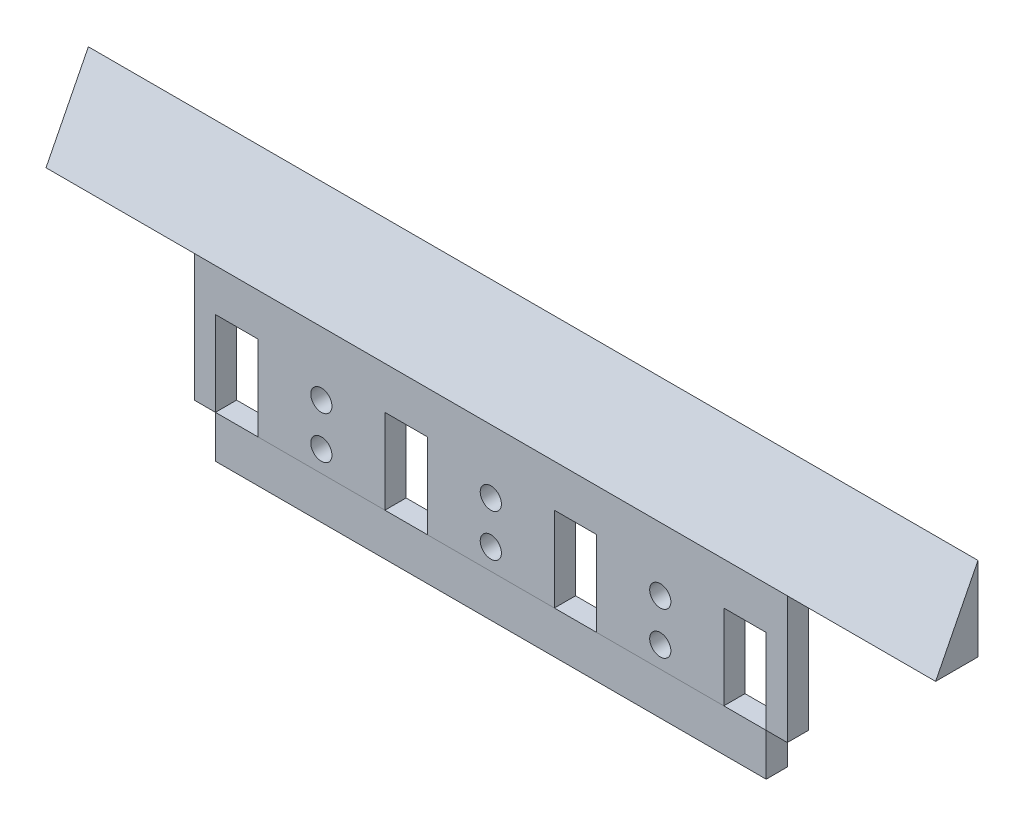
ISO-10303-21;
HEADER;
FILE_DESCRIPTION(('STEP AP214'),'2;1');
FILE_NAME('part.step','',(''),(''),'','','');
FILE_SCHEMA(('AUTOMOTIVE_DESIGN { 1 0 10303 214 1 1 1 1 }'));
ENDSEC;
DATA;
#1=APPLICATION_CONTEXT('core data for automotive mechanical design processes');
#2=APPLICATION_PROTOCOL_DEFINITION('international standard','automotive_design',2000,#1);
#3=PRODUCT_CONTEXT('',#1,'mechanical');
#4=PRODUCT('Part','Part','',(#3));
#5=PRODUCT_RELATED_PRODUCT_CATEGORY('part','',(#4));
#6=PRODUCT_DEFINITION_FORMATION('','',#4);
#7=PRODUCT_DEFINITION_CONTEXT('part definition',#1,'design');
#8=PRODUCT_DEFINITION('design','',#6,#7);
#9=PRODUCT_DEFINITION_SHAPE('','',#8);
#10=(LENGTH_UNIT() NAMED_UNIT(*) SI_UNIT(.MILLI.,.METRE.));
#11=(NAMED_UNIT(*) PLANE_ANGLE_UNIT() SI_UNIT($,.RADIAN.));
#12=(NAMED_UNIT(*) SI_UNIT($,.STERADIAN.) SOLID_ANGLE_UNIT());
#13=UNCERTAINTY_MEASURE_WITH_UNIT(LENGTH_MEASURE(1.E-05),#10,'distance_accuracy_value','');
#14=(GEOMETRIC_REPRESENTATION_CONTEXT(3) GLOBAL_UNCERTAINTY_ASSIGNED_CONTEXT((#13)) GLOBAL_UNIT_ASSIGNED_CONTEXT((#10,
#11,#12)) REPRESENTATION_CONTEXT('',''));
#15=CARTESIAN_POINT('',(0.,0.,0.));
#16=DIRECTION('',(0.,0.,1.));
#17=DIRECTION('',(1.,0.,0.));
#18=AXIS2_PLACEMENT_3D('',#15,#16,#17);
#19=CARTESIAN_POINT('',(7868.76400398858,2295.87786259542,0.));
#20=DIRECTION('',(1.,0.,0.));
#21=DIRECTION('',(0.,0.,-1.));
#22=AXIS2_PLACEMENT_3D('',#19,#20,#21);
#23=PLANE('',#22);
#24=DIRECTION('',(0.,0.,-1.));
#25=VECTOR('',#24,1.);
#26=CARTESIAN_POINT('',(7868.76400398858,2305.87786259542,0.));
#27=LINE('',#26,#25);
#28=CARTESIAN_POINT('',(7868.76400398858,2305.87786259542,5.));
#29=VERTEX_POINT('',#28);
#30=CARTESIAN_POINT('',(7868.76400398858,2305.87786259542,0.));
#31=VERTEX_POINT('',#30);
#32=EDGE_CURVE('E108',#29,#31,#27,.T.);
#33=ORIENTED_EDGE('',*,*,#32,.T.);
#34=DIRECTION('',(0.,1.,0.));
#35=VECTOR('',#34,1.);
#36=CARTESIAN_POINT('',(7868.76400398858,2295.87786259542,0.));
#37=LINE('',#36,#35);
#38=CARTESIAN_POINT('',(7868.76400398858,2295.87786259542,0.));
#39=VERTEX_POINT('',#38);
#40=EDGE_CURVE('E12',#39,#31,#37,.T.);
#41=ORIENTED_EDGE('',*,*,#40,.F.);
#42=DIRECTION('',(0.,0.,-1.));
#43=VECTOR('',#42,1.);
#44=CARTESIAN_POINT('',(7868.76400398858,2295.87786259542,0.));
#45=LINE('',#44,#43);
#46=CARTESIAN_POINT('',(7868.76400398858,2295.87786259542,5.));
#47=VERTEX_POINT('',#46);
#48=EDGE_CURVE('E96',#47,#39,#45,.T.);
#49=ORIENTED_EDGE('',*,*,#48,.F.);
#50=DIRECTION('',(0.,1.,0.));
#51=VECTOR('',#50,1.);
#52=CARTESIAN_POINT('',(7868.76400398858,2295.87786259542,5.));
#53=LINE('',#52,#51);
#54=EDGE_CURVE('E104',#47,#29,#53,.T.);
#55=ORIENTED_EDGE('',*,*,#54,.T.);
#56=EDGE_LOOP('',(#33,#41,#49,#55));
#57=FACE_BOUND('',#56,.T.);
#58=ADVANCED_FACE('F45',(#57),#23,.F.);
#59=CARTESIAN_POINT('',(7868.76400398858,2295.87786259542,0.));
#60=DIRECTION('',(0.,0.,1.));
#61=DIRECTION('',(1.,0.,0.));
#62=AXIS2_PLACEMENT_3D('',#59,#60,#61);
#63=PLANE('',#62);
#64=DIRECTION('',(1.,0.,0.));
#65=VECTOR('',#64,1.);
#66=CARTESIAN_POINT('',(7868.76400398858,2305.87786259542,0.));
#67=LINE('',#66,#65);
#68=CARTESIAN_POINT('',(7998.76400398858,2305.87786259542,0.));
#69=VERTEX_POINT('',#68);
#70=EDGE_CURVE('E100',#31,#69,#67,.T.);
#71=ORIENTED_EDGE('',*,*,#70,.T.);
#72=DIRECTION('',(0.,1.,0.));
#73=VECTOR('',#72,1.);
#74=CARTESIAN_POINT('',(7998.76400398858,2295.87786259542,0.));
#75=LINE('',#74,#73);
#76=CARTESIAN_POINT('',(7998.76400398858,2295.87786259542,0.));
#77=VERTEX_POINT('',#76);
#78=EDGE_CURVE('E53',#77,#69,#75,.T.);
#79=ORIENTED_EDGE('',*,*,#78,.F.);
#80=DIRECTION('',(1.,0.,0.));
#81=VECTOR('',#80,1.);
#82=CARTESIAN_POINT('',(7868.76400398858,2295.87786259542,0.));
#83=LINE('',#82,#81);
#84=EDGE_CURVE('E91',#39,#77,#83,.T.);
#85=ORIENTED_EDGE('',*,*,#84,.F.);
#86=ORIENTED_EDGE('',*,*,#40,.T.);
#87=EDGE_LOOP('',(#71,#79,#85,#86));
#88=FACE_BOUND('',#87,.T.);
#89=ADVANCED_FACE('F99',(#88),#63,.F.);
#90=CARTESIAN_POINT('',(7998.76400398858,2295.87786259542,0.));
#91=DIRECTION('',(-1.,0.,0.));
#92=DIRECTION('',(0.,0.,1.));
#93=AXIS2_PLACEMENT_3D('',#90,#91,#92);
#94=PLANE('',#93);
#95=DIRECTION('',(0.,0.,1.));
#96=VECTOR('',#95,1.);
#97=CARTESIAN_POINT('',(7998.76400398858,2305.87786259542,0.));
#98=LINE('',#97,#96);
#99=CARTESIAN_POINT('',(7998.76400398858,2305.87786259542,5.));
#100=VERTEX_POINT('',#99);
#101=EDGE_CURVE('E78',#69,#100,#98,.T.);
#102=ORIENTED_EDGE('',*,*,#101,.T.);
#103=DIRECTION('',(0.,1.,0.));
#104=VECTOR('',#103,1.);
#105=CARTESIAN_POINT('',(7998.76400398858,2295.87786259542,5.));
#106=LINE('',#105,#104);
#107=CARTESIAN_POINT('',(7998.76400398858,2295.87786259542,5.));
#108=VERTEX_POINT('',#107);
#109=EDGE_CURVE('E101',#108,#100,#106,.T.);
#110=ORIENTED_EDGE('',*,*,#109,.F.);
#111=DIRECTION('',(0.,0.,1.));
#112=VECTOR('',#111,1.);
#113=CARTESIAN_POINT('',(7998.76400398858,2295.87786259542,0.));
#114=LINE('',#113,#112);
#115=EDGE_CURVE('E94',#77,#108,#114,.T.);
#116=ORIENTED_EDGE('',*,*,#115,.F.);
#117=ORIENTED_EDGE('',*,*,#78,.T.);
#118=EDGE_LOOP('',(#102,#110,#116,#117));
#119=FACE_BOUND('',#118,.T.);
#120=ADVANCED_FACE('F102',(#119),#94,.F.);
#121=CARTESIAN_POINT('',(7868.76400398858,2295.87786259542,5.));
#122=DIRECTION('',(0.,0.,-1.));
#123=DIRECTION('',(-1.,0.,0.));
#124=AXIS2_PLACEMENT_3D('',#121,#122,#123);
#125=PLANE('',#124);
#126=DIRECTION('',(-1.,0.,0.));
#127=VECTOR('',#126,1.);
#128=CARTESIAN_POINT('',(7868.76400398858,2305.87786259542,5.));
#129=LINE('',#128,#127);
#130=EDGE_CURVE('E84',#100,#29,#129,.T.);
#131=ORIENTED_EDGE('',*,*,#130,.T.);
#132=ORIENTED_EDGE('',*,*,#54,.F.);
#133=DIRECTION('',(-1.,0.,0.));
#134=VECTOR('',#133,1.);
#135=CARTESIAN_POINT('',(7868.76400398858,2295.87786259542,5.));
#136=LINE('',#135,#134);
#137=EDGE_CURVE('E61',#108,#47,#136,.T.);
#138=ORIENTED_EDGE('',*,*,#137,.F.);
#139=ORIENTED_EDGE('',*,*,#109,.T.);
#140=EDGE_LOOP('',(#131,#132,#138,#139));
#141=FACE_BOUND('',#140,.T.);
#142=ADVANCED_FACE('F115',(#141),#125,.F.);
#143=CARTESIAN_POINT('',(0.,2295.87786259542,0.));
#144=DIRECTION('',(0.,1.,0.));
#145=DIRECTION('',(0.,0.,1.));
#146=AXIS2_PLACEMENT_3D('',#143,#144,#145);
#147=PLANE('',#146);
#148=ORIENTED_EDGE('',*,*,#48,.T.);
#149=ORIENTED_EDGE('',*,*,#84,.T.);
#150=ORIENTED_EDGE('',*,*,#115,.T.);
#151=ORIENTED_EDGE('',*,*,#137,.T.);
#152=EDGE_LOOP('',(#148,#149,#150,#151));
#153=FACE_BOUND('',#152,.T.);
#154=ADVANCED_FACE('F92',(#153),#147,.F.);
#155=CARTESIAN_POINT('',(0.,2305.87786259542,0.));
#156=DIRECTION('',(0.,1.,0.));
#157=DIRECTION('',(0.,0.,1.));
#158=AXIS2_PLACEMENT_3D('',#155,#156,#157);
#159=PLANE('',#158);
#160=ORIENTED_EDGE('',*,*,#32,.F.);
#161=ORIENTED_EDGE('',*,*,#130,.F.);
#162=ORIENTED_EDGE('',*,*,#101,.F.);
#163=ORIENTED_EDGE('',*,*,#70,.F.);
#164=EDGE_LOOP('',(#160,#161,#162,#163));
#165=FACE_BOUND('',#164,.T.);
#166=ADVANCED_FACE('F118',(#165),#159,.T.);
#167=CLOSED_SHELL('',(#58,#89,#120,#142,#154,#166));
#168=MANIFOLD_SOLID_BREP('B2',#167);
#169=CARTESIAN_POINT('',(7863.76400398858,2335.87786259542,5.));
#170=DIRECTION('',(1.,0.,0.));
#171=DIRECTION('',(0.,1.,0.));
#172=AXIS2_PLACEMENT_3D('',#169,#170,#171);
#173=PLANE('',#172);
#174=DIRECTION('',(0.,-4.88498130835069E-13,1.));
#175=VECTOR('',#174,1.);
#176=CARTESIAN_POINT('',(7863.76400398858,2335.87786259542,5.));
#177=LINE('',#176,#175);
#178=CARTESIAN_POINT('',(7863.76400398858,2335.87786259542,0.));
#179=VERTEX_POINT('',#178);
#180=CARTESIAN_POINT('',(7863.76400398858,2335.87786259542,5.));
#181=VERTEX_POINT('',#180);
#182=EDGE_CURVE('E43',#179,#181,#177,.T.);
#183=ORIENTED_EDGE('',*,*,#182,.F.);
#184=DIRECTION('',(0.,-1.,0.));
#185=VECTOR('',#184,1.);
#186=CARTESIAN_POINT('',(7863.76400398858,2335.87786259542,0.));
#187=LINE('',#186,#185);
#188=CARTESIAN_POINT('',(7863.76400398858,2305.87786259542,0.));
#189=VERTEX_POINT('',#188);
#190=EDGE_CURVE('E472',#179,#189,#187,.T.);
#191=ORIENTED_EDGE('',*,*,#190,.T.);
#192=DIRECTION('',(0.,0.,-1.));
#193=VECTOR('',#192,1.);
#194=CARTESIAN_POINT('',(7863.76400398858,2305.87786259542,5.));
#195=LINE('',#194,#193);
#196=CARTESIAN_POINT('',(7863.76400398858,2305.87786259542,5.));
#197=VERTEX_POINT('',#196);
#198=EDGE_CURVE('E177',#197,#189,#195,.T.);
#199=ORIENTED_EDGE('',*,*,#198,.F.);
#200=DIRECTION('',(0.,-1.,0.));
#201=VECTOR('',#200,1.);
#202=CARTESIAN_POINT('',(7863.76400398858,2335.87786259542,5.));
#203=LINE('',#202,#201);
#204=EDGE_CURVE('E437',#181,#197,#203,.T.);
#205=ORIENTED_EDGE('',*,*,#204,.F.);
#206=EDGE_LOOP('',(#183,#191,#199,#205));
#207=FACE_BOUND('',#206,.T.);
#208=ADVANCED_FACE('F169',(#207),#173,.F.);
#209=CARTESIAN_POINT('',(8003.76400398858,2335.87786259542,5.));
#210=DIRECTION('',(-1.,0.,0.));
#211=DIRECTION('',(0.,0.,1.));
#212=AXIS2_PLACEMENT_3D('',#209,#210,#211);
#213=PLANE('',#212);
#214=DIRECTION('',(0.,8.88178419700126E-13,-1.));
#215=VECTOR('',#214,1.);
#216=CARTESIAN_POINT('',(8003.76400398858,2335.87786259542,5.));
#217=LINE('',#216,#215);
#218=CARTESIAN_POINT('',(8003.76400398858,2335.87786259542,5.));
#219=VERTEX_POINT('',#218);
#220=CARTESIAN_POINT('',(8003.76400398858,2335.87786259542,0.));
#221=VERTEX_POINT('',#220);
#222=EDGE_CURVE('E466',#219,#221,#217,.T.);
#223=ORIENTED_EDGE('',*,*,#222,.F.);
#224=DIRECTION('',(0.,1.,0.));
#225=VECTOR('',#224,1.);
#226=CARTESIAN_POINT('',(8003.76400398858,2335.87786259542,5.));
#227=LINE('',#226,#225);
#228=CARTESIAN_POINT('',(8003.76400398858,2305.87786259542,5.));
#229=VERTEX_POINT('',#228);
#230=EDGE_CURVE('E432',#229,#219,#227,.T.);
#231=ORIENTED_EDGE('',*,*,#230,.F.);
#232=DIRECTION('',(0.,0.,-1.));
#233=VECTOR('',#232,1.);
#234=CARTESIAN_POINT('',(8003.76400398858,2305.87786259542,5.));
#235=LINE('',#234,#233);
#236=CARTESIAN_POINT('',(8003.76400398858,2305.87786259542,0.));
#237=VERTEX_POINT('',#236);
#238=EDGE_CURVE('E444',#229,#237,#235,.T.);
#239=ORIENTED_EDGE('',*,*,#238,.T.);
#240=DIRECTION('',(0.,1.,0.));
#241=VECTOR('',#240,1.);
#242=CARTESIAN_POINT('',(8003.76400398858,2335.87786259542,0.));
#243=LINE('',#242,#241);
#244=EDGE_CURVE('E448',#237,#221,#243,.T.);
#245=ORIENTED_EDGE('',*,*,#244,.T.);
#246=EDGE_LOOP('',(#223,#231,#239,#245));
#247=FACE_BOUND('',#246,.T.);
#248=ADVANCED_FACE('F463',(#247),#213,.F.);
#249=CARTESIAN_POINT('',(7863.76400398858,2305.87786259542,5.));
#250=DIRECTION('',(0.,1.,0.));
#251=DIRECTION('',(0.,0.,1.));
#252=AXIS2_PLACEMENT_3D('',#249,#250,#251);
#253=PLANE('',#252);
#254=DIRECTION('',(1.,0.,0.));
#255=VECTOR('',#254,1.);
#256=CARTESIAN_POINT('',(7863.76400398858,2305.87786259542,5.));
#257=LINE('',#256,#255);
#258=CARTESIAN_POINT('',(7878.76400398858,2305.87786259542,5.));
#259=VERTEX_POINT('',#258);
#260=CARTESIAN_POINT('',(7908.76400398858,2305.87786259542,5.));
#261=VERTEX_POINT('',#260);
#262=EDGE_CURVE('E417',#259,#261,#257,.T.);
#263=ORIENTED_EDGE('',*,*,#262,.F.);
#264=DIRECTION('',(0.,0.,-1.));
#265=VECTOR('',#264,1.);
#266=CARTESIAN_POINT('',(7878.76400398858,2305.87786259542,50.));
#267=LINE('',#266,#265);
#268=CARTESIAN_POINT('',(7878.76400398858,2305.87786259542,0.));
#269=VERTEX_POINT('',#268);
#270=EDGE_CURVE('E426',#259,#269,#267,.T.);
#271=ORIENTED_EDGE('',*,*,#270,.T.);
#272=DIRECTION('',(1.,0.,0.));
#273=VECTOR('',#272,1.);
#274=CARTESIAN_POINT('',(7863.76400398858,2305.87786259542,0.));
#275=LINE('',#274,#273);
#276=CARTESIAN_POINT('',(7908.76400398858,2305.87786259542,0.));
#277=VERTEX_POINT('',#276);
#278=EDGE_CURVE('E193',#269,#277,#275,.T.);
#279=ORIENTED_EDGE('',*,*,#278,.T.);
#280=DIRECTION('',(0.,0.,-1.));
#281=VECTOR('',#280,1.);
#282=CARTESIAN_POINT('',(7908.76400398858,2305.87786259542,50.));
#283=LINE('',#282,#281);
#284=EDGE_CURVE('E427',#261,#277,#283,.T.);
#285=ORIENTED_EDGE('',*,*,#284,.F.);
#286=EDGE_LOOP('',(#263,#271,#279,#285));
#287=FACE_BOUND('',#286,.T.);
#288=ADVANCED_FACE('F425',(#287),#253,.F.);
#289=CARTESIAN_POINT('',(7918.76400398858,2305.87786259542,5.));
#290=VERTEX_POINT('',#289);
#291=CARTESIAN_POINT('',(7948.76400398858,2305.87786259542,5.));
#292=VERTEX_POINT('',#291);
#293=EDGE_CURVE('E429',#290,#292,#257,.T.);
#294=ORIENTED_EDGE('',*,*,#293,.F.);
#295=DIRECTION('',(0.,0.,-1.));
#296=VECTOR('',#295,1.);
#297=CARTESIAN_POINT('',(7918.76400398858,2305.87786259542,50.));
#298=LINE('',#297,#296);
#299=CARTESIAN_POINT('',(7918.76400398858,2305.87786259542,0.));
#300=VERTEX_POINT('',#299);
#301=EDGE_CURVE('E513',#290,#300,#298,.T.);
#302=ORIENTED_EDGE('',*,*,#301,.T.);
#303=CARTESIAN_POINT('',(7948.76400398858,2305.87786259542,0.));
#304=VERTEX_POINT('',#303);
#305=EDGE_CURVE('E604',#300,#304,#275,.T.);
#306=ORIENTED_EDGE('',*,*,#305,.T.);
#307=DIRECTION('',(0.,0.,-1.));
#308=VECTOR('',#307,1.);
#309=CARTESIAN_POINT('',(7948.76400398858,2305.87786259542,50.));
#310=LINE('',#309,#308);
#311=EDGE_CURVE('E541',#292,#304,#310,.T.);
#312=ORIENTED_EDGE('',*,*,#311,.F.);
#313=EDGE_LOOP('',(#294,#302,#306,#312));
#314=FACE_BOUND('',#313,.T.);
#315=ADVANCED_FACE('F609',(#314),#253,.F.);
#316=CARTESIAN_POINT('',(7958.76400398858,2305.87786259542,5.));
#317=VERTEX_POINT('',#316);
#318=CARTESIAN_POINT('',(7988.76400398858,2305.87786259542,5.));
#319=VERTEX_POINT('',#318);
#320=EDGE_CURVE('E434',#317,#319,#257,.T.);
#321=ORIENTED_EDGE('',*,*,#320,.F.);
#322=DIRECTION('',(0.,0.,-1.));
#323=VECTOR('',#322,1.);
#324=CARTESIAN_POINT('',(7958.76400398858,2305.87786259542,50.));
#325=LINE('',#324,#323);
#326=CARTESIAN_POINT('',(7958.76400398858,2305.87786259542,0.));
#327=VERTEX_POINT('',#326);
#328=EDGE_CURVE('E535',#317,#327,#325,.T.);
#329=ORIENTED_EDGE('',*,*,#328,.T.);
#330=CARTESIAN_POINT('',(7988.76400398858,2305.87786259542,0.));
#331=VERTEX_POINT('',#330);
#332=EDGE_CURVE('E580',#327,#331,#275,.T.);
#333=ORIENTED_EDGE('',*,*,#332,.T.);
#334=DIRECTION('',(0.,0.,-1.));
#335=VECTOR('',#334,1.);
#336=CARTESIAN_POINT('',(7988.76400398858,2305.87786259542,50.));
#337=LINE('',#336,#335);
#338=EDGE_CURVE('E566',#319,#331,#337,.T.);
#339=ORIENTED_EDGE('',*,*,#338,.F.);
#340=EDGE_LOOP('',(#321,#329,#333,#339));
#341=FACE_BOUND('',#340,.T.);
#342=ADVANCED_FACE('F660',(#341),#253,.F.);
#343=CARTESIAN_POINT('',(7998.76400398858,2305.87786259542,5.));
#344=VERTEX_POINT('',#343);
#345=EDGE_CURVE('E433',#344,#229,#257,.T.);
#346=ORIENTED_EDGE('',*,*,#345,.F.);
#347=DIRECTION('',(0.,0.,-1.));
#348=VECTOR('',#347,1.);
#349=CARTESIAN_POINT('',(7998.76400398858,2305.87786259542,50.));
#350=LINE('',#349,#348);
#351=CARTESIAN_POINT('',(7998.76400398858,2305.87786259542,0.));
#352=VERTEX_POINT('',#351);
#353=EDGE_CURVE('E560',#344,#352,#350,.T.);
#354=ORIENTED_EDGE('',*,*,#353,.T.);
#355=EDGE_CURVE('E449',#352,#237,#275,.T.);
#356=ORIENTED_EDGE('',*,*,#355,.T.);
#357=ORIENTED_EDGE('',*,*,#238,.F.);
#358=EDGE_LOOP('',(#346,#354,#356,#357));
#359=FACE_BOUND('',#358,.T.);
#360=ADVANCED_FACE('F588',(#359),#253,.F.);
#361=CARTESIAN_POINT('',(7868.76400398858,2305.87786259542,0.));
#362=VERTEX_POINT('',#361);
#363=EDGE_CURVE('E445',#189,#362,#275,.T.);
#364=ORIENTED_EDGE('',*,*,#363,.T.);
#365=DIRECTION('',(0.,0.,-1.));
#366=VECTOR('',#365,1.);
#367=CARTESIAN_POINT('',(7868.76400398858,2305.87786259542,50.));
#368=LINE('',#367,#366);
#369=CARTESIAN_POINT('',(7868.76400398858,2305.87786259542,5.));
#370=VERTEX_POINT('',#369);
#371=EDGE_CURVE('E185',#370,#362,#368,.T.);
#372=ORIENTED_EDGE('',*,*,#371,.F.);
#373=EDGE_CURVE('E428',#197,#370,#257,.T.);
#374=ORIENTED_EDGE('',*,*,#373,.F.);
#375=ORIENTED_EDGE('',*,*,#198,.T.);
#376=EDGE_LOOP('',(#364,#372,#374,#375));
#377=FACE_BOUND('',#376,.T.);
#378=ADVANCED_FACE('F406',(#377),#253,.F.);
#379=CARTESIAN_POINT('',(0.,0.,5.));
#380=DIRECTION('',(0.,0.,1.));
#381=DIRECTION('',(1.,0.,0.));
#382=AXIS2_PLACEMENT_3D('',#379,#380,#381);
#383=PLANE('',#382);
#384=CARTESIAN_POINT('',(7973.76400398858,2310.87786259542,5.));
#385=DIRECTION('',(0.,0.,1.));
#386=DIRECTION('',(1.,0.,0.));
#387=AXIS2_PLACEMENT_3D('',#384,#385,#386);
#388=CIRCLE('',#387,2.50000000000016);
#389=CARTESIAN_POINT('',(7976.26400398858,2310.87786259542,5.));
#390=VERTEX_POINT('',#389);
#391=EDGE_CURVE('E392',#390,#390,#388,.T.);
#392=ORIENTED_EDGE('',*,*,#391,.F.);
#393=EDGE_LOOP('',(#392));
#394=FACE_BOUND('',#393,.T.);
#395=CARTESIAN_POINT('',(7973.76400398858,2320.87786259543,5.));
#396=DIRECTION('',(0.,0.,1.));
#397=DIRECTION('',(1.,0.,0.));
#398=AXIS2_PLACEMENT_3D('',#395,#396,#397);
#399=CIRCLE('',#398,2.50000000000016);
#400=CARTESIAN_POINT('',(7976.26400398858,2320.87786259543,5.));
#401=VERTEX_POINT('',#400);
#402=EDGE_CURVE('E382',#401,#401,#399,.T.);
#403=ORIENTED_EDGE('',*,*,#402,.F.);
#404=EDGE_LOOP('',(#403));
#405=FACE_BOUND('',#404,.T.);
#406=CARTESIAN_POINT('',(7933.76400398858,2310.87786259542,5.));
#407=DIRECTION('',(0.,0.,1.));
#408=DIRECTION('',(1.,0.,0.));
#409=AXIS2_PLACEMENT_3D('',#406,#407,#408);
#410=CIRCLE('',#409,2.50000000000016);
#411=CARTESIAN_POINT('',(7936.26400398858,2310.87786259542,5.));
#412=VERTEX_POINT('',#411);
#413=EDGE_CURVE('E379',#412,#412,#410,.T.);
#414=ORIENTED_EDGE('',*,*,#413,.F.);
#415=EDGE_LOOP('',(#414));
#416=FACE_BOUND('',#415,.T.);
#417=CARTESIAN_POINT('',(7933.76400398858,2320.87786259543,5.));
#418=DIRECTION('',(0.,0.,1.));
#419=DIRECTION('',(1.,0.,0.));
#420=AXIS2_PLACEMENT_3D('',#417,#418,#419);
#421=CIRCLE('',#420,2.50000000000016);
#422=CARTESIAN_POINT('',(7936.26400398858,2320.87786259543,5.));
#423=VERTEX_POINT('',#422);
#424=EDGE_CURVE('E376',#423,#423,#421,.T.);
#425=ORIENTED_EDGE('',*,*,#424,.F.);
#426=EDGE_LOOP('',(#425));
#427=FACE_BOUND('',#426,.T.);
#428=CARTESIAN_POINT('',(7893.76400398858,2310.87786259542,5.));
#429=DIRECTION('',(0.,0.,1.));
#430=DIRECTION('',(1.,0.,0.));
#431=AXIS2_PLACEMENT_3D('',#428,#429,#430);
#432=CIRCLE('',#431,2.50000000000016);
#433=CARTESIAN_POINT('',(7896.26400398858,2310.87786259542,5.));
#434=VERTEX_POINT('',#433);
#435=EDGE_CURVE('E372',#434,#434,#432,.T.);
#436=ORIENTED_EDGE('',*,*,#435,.F.);
#437=EDGE_LOOP('',(#436));
#438=FACE_BOUND('',#437,.T.);
#439=CARTESIAN_POINT('',(7893.76400398858,2320.87786259543,5.));
#440=DIRECTION('',(0.,0.,1.));
#441=DIRECTION('',(1.,0.,0.));
#442=AXIS2_PLACEMENT_3D('',#439,#440,#441);
#443=CIRCLE('',#442,2.50000000000016);
#444=CARTESIAN_POINT('',(7896.26400398858,2320.87786259543,5.));
#445=VERTEX_POINT('',#444);
#446=EDGE_CURVE('E355',#445,#445,#443,.T.);
#447=ORIENTED_EDGE('',*,*,#446,.F.);
#448=EDGE_LOOP('',(#447));
#449=FACE_BOUND('',#448,.T.);
#450=DIRECTION('',(0.,1.,0.));
#451=VECTOR('',#450,1.);
#452=CARTESIAN_POINT('',(7878.76400398858,0.,5.));
#453=LINE('',#452,#451);
#454=CARTESIAN_POINT('',(7878.76400398858,2325.87786259543,5.));
#455=VERTEX_POINT('',#454);
#456=EDGE_CURVE('E414',#259,#455,#453,.T.);
#457=ORIENTED_EDGE('',*,*,#456,.F.);
#458=ORIENTED_EDGE('',*,*,#262,.T.);
#459=DIRECTION('',(0.,-1.,0.));
#460=VECTOR('',#459,1.);
#461=CARTESIAN_POINT('',(7908.76400398858,0.,5.));
#462=LINE('',#461,#460);
#463=CARTESIAN_POINT('',(7908.76400398858,2325.87786259543,5.));
#464=VERTEX_POINT('',#463);
#465=EDGE_CURVE('E516',#464,#261,#462,.T.);
#466=ORIENTED_EDGE('',*,*,#465,.F.);
#467=DIRECTION('',(-1.,0.,0.));
#468=VECTOR('',#467,1.);
#469=CARTESIAN_POINT('',(0.,2325.87786259543,5.));
#470=LINE('',#469,#468);
#471=CARTESIAN_POINT('',(7918.76400398858,2325.87786259543,5.));
#472=VERTEX_POINT('',#471);
#473=EDGE_CURVE('E523',#472,#464,#470,.T.);
#474=ORIENTED_EDGE('',*,*,#473,.F.);
#475=DIRECTION('',(0.,1.,0.));
#476=VECTOR('',#475,1.);
#477=CARTESIAN_POINT('',(7918.76400398858,0.,5.));
#478=LINE('',#477,#476);
#479=EDGE_CURVE('E525',#290,#472,#478,.T.);
#480=ORIENTED_EDGE('',*,*,#479,.F.);
#481=ORIENTED_EDGE('',*,*,#293,.T.);
#482=DIRECTION('',(0.,-1.,0.));
#483=VECTOR('',#482,1.);
#484=CARTESIAN_POINT('',(7948.76400398858,0.,5.));
#485=LINE('',#484,#483);
#486=CARTESIAN_POINT('',(7948.76400398858,2325.87786259543,5.));
#487=VERTEX_POINT('',#486);
#488=EDGE_CURVE('E538',#487,#292,#485,.T.);
#489=ORIENTED_EDGE('',*,*,#488,.F.);
#490=DIRECTION('',(-1.,0.,0.));
#491=VECTOR('',#490,1.);
#492=CARTESIAN_POINT('',(0.,2325.87786259543,5.));
#493=LINE('',#492,#491);
#494=CARTESIAN_POINT('',(7958.76400398858,2325.87786259543,5.));
#495=VERTEX_POINT('',#494);
#496=EDGE_CURVE('E548',#495,#487,#493,.T.);
#497=ORIENTED_EDGE('',*,*,#496,.F.);
#498=DIRECTION('',(0.,1.,0.));
#499=VECTOR('',#498,1.);
#500=CARTESIAN_POINT('',(7958.76400398858,0.,5.));
#501=LINE('',#500,#499);
#502=EDGE_CURVE('E550',#317,#495,#501,.T.);
#503=ORIENTED_EDGE('',*,*,#502,.F.);
#504=ORIENTED_EDGE('',*,*,#320,.T.);
#505=DIRECTION('',(0.,-1.,0.));
#506=VECTOR('',#505,1.);
#507=CARTESIAN_POINT('',(7988.76400398858,0.,5.));
#508=LINE('',#507,#506);
#509=CARTESIAN_POINT('',(7988.76400398858,2325.87786259543,5.));
#510=VERTEX_POINT('',#509);
#511=EDGE_CURVE('E563',#510,#319,#508,.T.);
#512=ORIENTED_EDGE('',*,*,#511,.F.);
#513=DIRECTION('',(-1.,0.,0.));
#514=VECTOR('',#513,1.);
#515=CARTESIAN_POINT('',(0.,2325.87786259543,5.));
#516=LINE('',#515,#514);
#517=CARTESIAN_POINT('',(7998.76400398858,2325.87786259543,5.));
#518=VERTEX_POINT('',#517);
#519=EDGE_CURVE('E573',#518,#510,#516,.T.);
#520=ORIENTED_EDGE('',*,*,#519,.F.);
#521=DIRECTION('',(0.,1.,0.));
#522=VECTOR('',#521,1.);
#523=CARTESIAN_POINT('',(7998.76400398858,0.,5.));
#524=LINE('',#523,#522);
#525=EDGE_CURVE('E574',#344,#518,#524,.T.);
#526=ORIENTED_EDGE('',*,*,#525,.F.);
#527=ORIENTED_EDGE('',*,*,#345,.T.);
#528=ORIENTED_EDGE('',*,*,#230,.T.);
#529=DIRECTION('',(-1.,0.,0.));
#530=VECTOR('',#529,1.);
#531=CARTESIAN_POINT('',(7863.76400398858,2335.87786259542,5.));
#532=LINE('',#531,#530);
#533=EDGE_CURVE('E441',#219,#181,#532,.T.);
#534=ORIENTED_EDGE('',*,*,#533,.T.);
#535=ORIENTED_EDGE('',*,*,#204,.T.);
#536=ORIENTED_EDGE('',*,*,#373,.T.);
#537=DIRECTION('',(0.,-1.,0.));
#538=VECTOR('',#537,1.);
#539=CARTESIAN_POINT('',(7868.76400398858,0.,5.));
#540=LINE('',#539,#538);
#541=CARTESIAN_POINT('',(7868.76400398858,2325.87786259543,5.));
#542=VERTEX_POINT('',#541);
#543=EDGE_CURVE('E499',#542,#370,#540,.T.);
#544=ORIENTED_EDGE('',*,*,#543,.F.);
#545=DIRECTION('',(-1.,0.,0.));
#546=VECTOR('',#545,1.);
#547=CARTESIAN_POINT('',(0.,2325.87786259543,5.));
#548=LINE('',#547,#546);
#549=EDGE_CURVE('E420',#455,#542,#548,.T.);
#550=ORIENTED_EDGE('',*,*,#549,.F.);
#551=EDGE_LOOP('',(#457,#458,#466,#474,#480,#481,#489,#497,#503,#504,#512,#520,#526,#527,#528,
#534,#535,#536,#544,#550));
#552=FACE_BOUND('',#551,.T.);
#553=ADVANCED_FACE('F402',(#394,#405,#416,#427,#438,#449,#552),#383,.T.);
#554=CARTESIAN_POINT('',(0.,0.,0.));
#555=DIRECTION('',(0.,0.,1.));
#556=DIRECTION('',(1.,0.,0.));
#557=AXIS2_PLACEMENT_3D('',#554,#555,#556);
#558=PLANE('',#557);
#559=CARTESIAN_POINT('',(7973.76400398858,2310.87786259542,0.));
#560=DIRECTION('',(0.,0.,1.));
#561=DIRECTION('',(1.,0.,0.));
#562=AXIS2_PLACEMENT_3D('',#559,#560,#561);
#563=CIRCLE('',#562,2.50000000000016);
#564=CARTESIAN_POINT('',(7976.26400398858,2310.87786259542,0.));
#565=VERTEX_POINT('',#564);
#566=EDGE_CURVE('E172',#565,#565,#563,.T.);
#567=ORIENTED_EDGE('',*,*,#566,.T.);
#568=EDGE_LOOP('',(#567));
#569=FACE_BOUND('',#568,.T.);
#570=CARTESIAN_POINT('',(7973.76400398858,2320.87786259543,0.));
#571=DIRECTION('',(0.,0.,1.));
#572=DIRECTION('',(1.,0.,0.));
#573=AXIS2_PLACEMENT_3D('',#570,#571,#572);
#574=CIRCLE('',#573,2.50000000000016);
#575=CARTESIAN_POINT('',(7976.26400398858,2320.87786259543,0.));
#576=VERTEX_POINT('',#575);
#577=EDGE_CURVE('E380',#576,#576,#574,.T.);
#578=ORIENTED_EDGE('',*,*,#577,.T.);
#579=EDGE_LOOP('',(#578));
#580=FACE_BOUND('',#579,.T.);
#581=CARTESIAN_POINT('',(7933.76400398858,2310.87786259542,0.));
#582=DIRECTION('',(0.,0.,1.));
#583=DIRECTION('',(1.,0.,0.));
#584=AXIS2_PLACEMENT_3D('',#581,#582,#583);
#585=CIRCLE('',#584,2.50000000000016);
#586=CARTESIAN_POINT('',(7936.26400398858,2310.87786259542,0.));
#587=VERTEX_POINT('',#586);
#588=EDGE_CURVE('E377',#587,#587,#585,.T.);
#589=ORIENTED_EDGE('',*,*,#588,.T.);
#590=EDGE_LOOP('',(#589));
#591=FACE_BOUND('',#590,.T.);
#592=CARTESIAN_POINT('',(7933.76400398858,2320.87786259543,0.));
#593=DIRECTION('',(0.,0.,1.));
#594=DIRECTION('',(1.,0.,0.));
#595=AXIS2_PLACEMENT_3D('',#592,#593,#594);
#596=CIRCLE('',#595,2.50000000000016);
#597=CARTESIAN_POINT('',(7936.26400398858,2320.87786259543,0.));
#598=VERTEX_POINT('',#597);
#599=EDGE_CURVE('E373',#598,#598,#596,.T.);
#600=ORIENTED_EDGE('',*,*,#599,.T.);
#601=EDGE_LOOP('',(#600));
#602=FACE_BOUND('',#601,.T.);
#603=CARTESIAN_POINT('',(7893.76400398858,2310.87786259542,0.));
#604=DIRECTION('',(0.,0.,1.));
#605=DIRECTION('',(1.,0.,0.));
#606=AXIS2_PLACEMENT_3D('',#603,#604,#605);
#607=CIRCLE('',#606,2.50000000000016);
#608=CARTESIAN_POINT('',(7896.26400398858,2310.87786259542,0.));
#609=VERTEX_POINT('',#608);
#610=EDGE_CURVE('E369',#609,#609,#607,.T.);
#611=ORIENTED_EDGE('',*,*,#610,.T.);
#612=EDGE_LOOP('',(#611));
#613=FACE_BOUND('',#612,.T.);
#614=CARTESIAN_POINT('',(7893.76400398858,2320.87786259543,0.));
#615=DIRECTION('',(0.,0.,1.));
#616=DIRECTION('',(1.,0.,0.));
#617=AXIS2_PLACEMENT_3D('',#614,#615,#616);
#618=CIRCLE('',#617,2.50000000000016);
#619=CARTESIAN_POINT('',(7896.26400398858,2320.87786259543,0.));
#620=VERTEX_POINT('',#619);
#621=EDGE_CURVE('E352',#620,#620,#618,.T.);
#622=ORIENTED_EDGE('',*,*,#621,.T.);
#623=EDGE_LOOP('',(#622));
#624=FACE_BOUND('',#623,.T.);
#625=ORIENTED_EDGE('',*,*,#278,.F.);
#626=DIRECTION('',(0.,-1.,0.));
#627=VECTOR('',#626,1.);
#628=CARTESIAN_POINT('',(7878.76400398858,2325.87786259543,0.));
#629=LINE('',#628,#627);
#630=CARTESIAN_POINT('',(7878.76400398858,2325.87786259543,0.));
#631=VERTEX_POINT('',#630);
#632=EDGE_CURVE('E488',#631,#269,#629,.T.);
#633=ORIENTED_EDGE('',*,*,#632,.F.);
#634=DIRECTION('',(1.,0.,0.));
#635=VECTOR('',#634,1.);
#636=CARTESIAN_POINT('',(7878.76400398858,2325.87786259543,0.));
#637=LINE('',#636,#635);
#638=CARTESIAN_POINT('',(7868.76400398858,2325.87786259543,0.));
#639=VERTEX_POINT('',#638);
#640=EDGE_CURVE('E492',#639,#631,#637,.T.);
#641=ORIENTED_EDGE('',*,*,#640,.F.);
#642=DIRECTION('',(0.,1.,0.));
#643=VECTOR('',#642,1.);
#644=CARTESIAN_POINT('',(7868.76400398858,2325.87786259543,0.));
#645=LINE('',#644,#643);
#646=EDGE_CURVE('E489',#362,#639,#645,.T.);
#647=ORIENTED_EDGE('',*,*,#646,.F.);
#648=ORIENTED_EDGE('',*,*,#363,.F.);
#649=ORIENTED_EDGE('',*,*,#190,.F.);
#650=DIRECTION('',(-1.,0.,0.));
#651=VECTOR('',#650,1.);
#652=CARTESIAN_POINT('',(7863.76400398858,2335.87786259542,0.));
#653=LINE('',#652,#651);
#654=EDGE_CURVE('E454',#221,#179,#653,.T.);
#655=ORIENTED_EDGE('',*,*,#654,.F.);
#656=ORIENTED_EDGE('',*,*,#244,.F.);
#657=ORIENTED_EDGE('',*,*,#355,.F.);
#658=DIRECTION('',(0.,-1.,0.));
#659=VECTOR('',#658,1.);
#660=CARTESIAN_POINT('',(7998.76400398858,2325.87786259543,0.));
#661=LINE('',#660,#659);
#662=CARTESIAN_POINT('',(7998.76400398858,2325.87786259543,0.));
#663=VERTEX_POINT('',#662);
#664=EDGE_CURVE('E552',#663,#352,#661,.T.);
#665=ORIENTED_EDGE('',*,*,#664,.F.);
#666=DIRECTION('',(1.,0.,0.));
#667=VECTOR('',#666,1.);
#668=CARTESIAN_POINT('',(7998.76400398858,2325.87786259543,0.));
#669=LINE('',#668,#667);
#670=CARTESIAN_POINT('',(7988.76400398858,2325.87786259543,0.));
#671=VERTEX_POINT('',#670);
#672=EDGE_CURVE('E557',#671,#663,#669,.T.);
#673=ORIENTED_EDGE('',*,*,#672,.F.);
#674=DIRECTION('',(0.,1.,0.));
#675=VECTOR('',#674,1.);
#676=CARTESIAN_POINT('',(7988.76400398858,2325.87786259543,0.));
#677=LINE('',#676,#675);
#678=EDGE_CURVE('E554',#331,#671,#677,.T.);
#679=ORIENTED_EDGE('',*,*,#678,.F.);
#680=ORIENTED_EDGE('',*,*,#332,.F.);
#681=DIRECTION('',(0.,-1.,0.));
#682=VECTOR('',#681,1.);
#683=CARTESIAN_POINT('',(7958.76400398858,2325.87786259543,0.));
#684=LINE('',#683,#682);
#685=CARTESIAN_POINT('',(7958.76400398858,2325.87786259543,0.));
#686=VERTEX_POINT('',#685);
#687=EDGE_CURVE('E527',#686,#327,#684,.T.);
#688=ORIENTED_EDGE('',*,*,#687,.F.);
#689=DIRECTION('',(1.,0.,0.));
#690=VECTOR('',#689,1.);
#691=CARTESIAN_POINT('',(7958.76400398858,2325.87786259543,0.));
#692=LINE('',#691,#690);
#693=CARTESIAN_POINT('',(7948.76400398858,2325.87786259543,0.));
#694=VERTEX_POINT('',#693);
#695=EDGE_CURVE('E532',#694,#686,#692,.T.);
#696=ORIENTED_EDGE('',*,*,#695,.F.);
#697=DIRECTION('',(0.,1.,0.));
#698=VECTOR('',#697,1.);
#699=CARTESIAN_POINT('',(7948.76400398858,2325.87786259543,0.));
#700=LINE('',#699,#698);
#701=EDGE_CURVE('E529',#304,#694,#700,.T.);
#702=ORIENTED_EDGE('',*,*,#701,.F.);
#703=ORIENTED_EDGE('',*,*,#305,.F.);
#704=DIRECTION('',(0.,-1.,0.));
#705=VECTOR('',#704,1.);
#706=CARTESIAN_POINT('',(7918.76400398858,2325.87786259543,0.));
#707=LINE('',#706,#705);
#708=CARTESIAN_POINT('',(7918.76400398858,2325.87786259543,0.));
#709=VERTEX_POINT('',#708);
#710=EDGE_CURVE('E423',#709,#300,#707,.T.);
#711=ORIENTED_EDGE('',*,*,#710,.F.);
#712=DIRECTION('',(1.,0.,0.));
#713=VECTOR('',#712,1.);
#714=CARTESIAN_POINT('',(7918.76400398858,2325.87786259543,0.));
#715=LINE('',#714,#713);
#716=CARTESIAN_POINT('',(7908.76400398858,2325.87786259543,0.));
#717=VERTEX_POINT('',#716);
#718=EDGE_CURVE('E510',#717,#709,#715,.T.);
#719=ORIENTED_EDGE('',*,*,#718,.F.);
#720=DIRECTION('',(0.,1.,0.));
#721=VECTOR('',#720,1.);
#722=CARTESIAN_POINT('',(7908.76400398858,2325.87786259543,0.));
#723=LINE('',#722,#721);
#724=EDGE_CURVE('E507',#277,#717,#723,.T.);
#725=ORIENTED_EDGE('',*,*,#724,.F.);
#726=EDGE_LOOP('',(#625,#633,#641,#647,#648,#649,#655,#656,#657,#665,#673,#679,#680,#688,#696,
#702,#703,#711,#719,#725));
#727=FACE_BOUND('',#726,.T.);
#728=ADVANCED_FACE('F405',(#569,#580,#591,#602,#613,#624,#727),#558,.F.);
#729=CARTESIAN_POINT('',(7998.76400398858,2325.87786259543,50.));
#730=DIRECTION('',(1.,0.,0.));
#731=DIRECTION('',(0.,0.,-1.));
#732=AXIS2_PLACEMENT_3D('',#729,#730,#731);
#733=PLANE('',#732);
#734=ORIENTED_EDGE('',*,*,#525,.T.);
#735=DIRECTION('',(0.,0.,-1.));
#736=VECTOR('',#735,1.);
#737=CARTESIAN_POINT('',(7998.76400398858,2325.87786259543,50.));
#738=LINE('',#737,#736);
#739=EDGE_CURVE('E561',#518,#663,#738,.T.);
#740=ORIENTED_EDGE('',*,*,#739,.T.);
#741=ORIENTED_EDGE('',*,*,#664,.T.);
#742=ORIENTED_EDGE('',*,*,#353,.F.);
#743=EDGE_LOOP('',(#734,#740,#741,#742));
#744=FACE_BOUND('',#743,.T.);
#745=ADVANCED_FACE('F592',(#744),#733,.F.);
#746=CARTESIAN_POINT('',(7998.76400398858,2325.87786259543,50.));
#747=DIRECTION('',(0.,1.,0.));
#748=DIRECTION('',(0.,0.,1.));
#749=AXIS2_PLACEMENT_3D('',#746,#747,#748);
#750=PLANE('',#749);
#751=ORIENTED_EDGE('',*,*,#519,.T.);
#752=DIRECTION('',(0.,0.,-1.));
#753=VECTOR('',#752,1.);
#754=CARTESIAN_POINT('',(7988.76400398858,2325.87786259543,50.));
#755=LINE('',#754,#753);
#756=EDGE_CURVE('E564',#510,#671,#755,.T.);
#757=ORIENTED_EDGE('',*,*,#756,.T.);
#758=ORIENTED_EDGE('',*,*,#672,.T.);
#759=ORIENTED_EDGE('',*,*,#739,.F.);
#760=EDGE_LOOP('',(#751,#757,#758,#759));
#761=FACE_BOUND('',#760,.T.);
#762=ADVANCED_FACE('F594',(#761),#750,.F.);
#763=CARTESIAN_POINT('',(7988.76400398858,2325.87786259543,50.));
#764=DIRECTION('',(-1.,0.,0.));
#765=DIRECTION('',(0.,0.,1.));
#766=AXIS2_PLACEMENT_3D('',#763,#764,#765);
#767=PLANE('',#766);
#768=ORIENTED_EDGE('',*,*,#511,.T.);
#769=ORIENTED_EDGE('',*,*,#338,.T.);
#770=ORIENTED_EDGE('',*,*,#678,.T.);
#771=ORIENTED_EDGE('',*,*,#756,.F.);
#772=EDGE_LOOP('',(#768,#769,#770,#771));
#773=FACE_BOUND('',#772,.T.);
#774=ADVANCED_FACE('F598',(#773),#767,.F.);
#775=CARTESIAN_POINT('',(7958.76400398858,2325.87786259543,50.));
#776=DIRECTION('',(1.,0.,0.));
#777=DIRECTION('',(0.,0.,-1.));
#778=AXIS2_PLACEMENT_3D('',#775,#776,#777);
#779=PLANE('',#778);
#780=ORIENTED_EDGE('',*,*,#502,.T.);
#781=DIRECTION('',(0.,0.,-1.));
#782=VECTOR('',#781,1.);
#783=CARTESIAN_POINT('',(7958.76400398858,2325.87786259543,50.));
#784=LINE('',#783,#782);
#785=EDGE_CURVE('E536',#495,#686,#784,.T.);
#786=ORIENTED_EDGE('',*,*,#785,.T.);
#787=ORIENTED_EDGE('',*,*,#687,.T.);
#788=ORIENTED_EDGE('',*,*,#328,.F.);
#789=EDGE_LOOP('',(#780,#786,#787,#788));
#790=FACE_BOUND('',#789,.T.);
#791=ADVANCED_FACE('F669',(#790),#779,.F.);
#792=CARTESIAN_POINT('',(7958.76400398858,2325.87786259543,50.));
#793=DIRECTION('',(0.,1.,0.));
#794=DIRECTION('',(0.,0.,1.));
#795=AXIS2_PLACEMENT_3D('',#792,#793,#794);
#796=PLANE('',#795);
#797=ORIENTED_EDGE('',*,*,#496,.T.);
#798=DIRECTION('',(0.,0.,-1.));
#799=VECTOR('',#798,1.);
#800=CARTESIAN_POINT('',(7948.76400398858,2325.87786259543,50.));
#801=LINE('',#800,#799);
#802=EDGE_CURVE('E539',#487,#694,#801,.T.);
#803=ORIENTED_EDGE('',*,*,#802,.T.);
#804=ORIENTED_EDGE('',*,*,#695,.T.);
#805=ORIENTED_EDGE('',*,*,#785,.F.);
#806=EDGE_LOOP('',(#797,#803,#804,#805));
#807=FACE_BOUND('',#806,.T.);
#808=ADVANCED_FACE('F618',(#807),#796,.F.);
#809=CARTESIAN_POINT('',(7948.76400398858,2325.87786259543,50.));
#810=DIRECTION('',(-1.,0.,0.));
#811=DIRECTION('',(0.,0.,1.));
#812=AXIS2_PLACEMENT_3D('',#809,#810,#811);
#813=PLANE('',#812);
#814=ORIENTED_EDGE('',*,*,#488,.T.);
#815=ORIENTED_EDGE('',*,*,#311,.T.);
#816=ORIENTED_EDGE('',*,*,#701,.T.);
#817=ORIENTED_EDGE('',*,*,#802,.F.);
#818=EDGE_LOOP('',(#814,#815,#816,#817));
#819=FACE_BOUND('',#818,.T.);
#820=ADVANCED_FACE('F613',(#819),#813,.F.);
#821=CARTESIAN_POINT('',(7918.76400398858,2325.87786259543,50.));
#822=DIRECTION('',(1.,0.,0.));
#823=DIRECTION('',(0.,0.,-1.));
#824=AXIS2_PLACEMENT_3D('',#821,#822,#823);
#825=PLANE('',#824);
#826=ORIENTED_EDGE('',*,*,#479,.T.);
#827=DIRECTION('',(0.,0.,-1.));
#828=VECTOR('',#827,1.);
#829=CARTESIAN_POINT('',(7918.76400398858,2325.87786259543,50.));
#830=LINE('',#829,#828);
#831=EDGE_CURVE('E514',#472,#709,#830,.T.);
#832=ORIENTED_EDGE('',*,*,#831,.T.);
#833=ORIENTED_EDGE('',*,*,#710,.T.);
#834=ORIENTED_EDGE('',*,*,#301,.F.);
#835=EDGE_LOOP('',(#826,#832,#833,#834));
#836=FACE_BOUND('',#835,.T.);
#837=ADVANCED_FACE('F625',(#836),#825,.F.);
#838=CARTESIAN_POINT('',(7918.76400398858,2325.87786259543,50.));
#839=DIRECTION('',(0.,1.,0.));
#840=DIRECTION('',(0.,0.,1.));
#841=AXIS2_PLACEMENT_3D('',#838,#839,#840);
#842=PLANE('',#841);
#843=ORIENTED_EDGE('',*,*,#473,.T.);
#844=DIRECTION('',(0.,0.,-1.));
#845=VECTOR('',#844,1.);
#846=CARTESIAN_POINT('',(7908.76400398858,2325.87786259543,50.));
#847=LINE('',#846,#845);
#848=EDGE_CURVE('E517',#464,#717,#847,.T.);
#849=ORIENTED_EDGE('',*,*,#848,.T.);
#850=ORIENTED_EDGE('',*,*,#718,.T.);
#851=ORIENTED_EDGE('',*,*,#831,.F.);
#852=EDGE_LOOP('',(#843,#849,#850,#851));
#853=FACE_BOUND('',#852,.T.);
#854=ADVANCED_FACE('F627',(#853),#842,.F.);
#855=CARTESIAN_POINT('',(7908.76400398858,2325.87786259543,50.));
#856=DIRECTION('',(-1.,0.,0.));
#857=DIRECTION('',(0.,0.,1.));
#858=AXIS2_PLACEMENT_3D('',#855,#856,#857);
#859=PLANE('',#858);
#860=ORIENTED_EDGE('',*,*,#465,.T.);
#861=ORIENTED_EDGE('',*,*,#284,.T.);
#862=ORIENTED_EDGE('',*,*,#724,.T.);
#863=ORIENTED_EDGE('',*,*,#848,.F.);
#864=EDGE_LOOP('',(#860,#861,#862,#863));
#865=FACE_BOUND('',#864,.T.);
#866=ADVANCED_FACE('F632',(#865),#859,.F.);
#867=CARTESIAN_POINT('',(7878.76400398858,2325.87786259543,50.));
#868=DIRECTION('',(1.,0.,0.));
#869=DIRECTION('',(0.,0.,-1.));
#870=AXIS2_PLACEMENT_3D('',#867,#868,#869);
#871=PLANE('',#870);
#872=ORIENTED_EDGE('',*,*,#456,.T.);
#873=DIRECTION('',(0.,0.,-1.));
#874=VECTOR('',#873,1.);
#875=CARTESIAN_POINT('',(7878.76400398858,2325.87786259543,50.));
#876=LINE('',#875,#874);
#877=EDGE_CURVE('E497',#455,#631,#876,.T.);
#878=ORIENTED_EDGE('',*,*,#877,.T.);
#879=ORIENTED_EDGE('',*,*,#632,.T.);
#880=ORIENTED_EDGE('',*,*,#270,.F.);
#881=EDGE_LOOP('',(#872,#878,#879,#880));
#882=FACE_BOUND('',#881,.T.);
#883=ADVANCED_FACE('F634',(#882),#871,.F.);
#884=CARTESIAN_POINT('',(7878.76400398858,2325.87786259543,50.));
#885=DIRECTION('',(0.,1.,0.));
#886=DIRECTION('',(0.,0.,1.));
#887=AXIS2_PLACEMENT_3D('',#884,#885,#886);
#888=PLANE('',#887);
#889=ORIENTED_EDGE('',*,*,#549,.T.);
#890=DIRECTION('',(0.,0.,-1.));
#891=VECTOR('',#890,1.);
#892=CARTESIAN_POINT('',(7868.76400398858,2325.87786259543,50.));
#893=LINE('',#892,#891);
#894=EDGE_CURVE('E500',#542,#639,#893,.T.);
#895=ORIENTED_EDGE('',*,*,#894,.T.);
#896=ORIENTED_EDGE('',*,*,#640,.T.);
#897=ORIENTED_EDGE('',*,*,#877,.F.);
#898=EDGE_LOOP('',(#889,#895,#896,#897));
#899=FACE_BOUND('',#898,.T.);
#900=ADVANCED_FACE('F640',(#899),#888,.F.);
#901=CARTESIAN_POINT('',(7868.76400398858,2325.87786259543,50.));
#902=DIRECTION('',(-1.,0.,0.));
#903=DIRECTION('',(0.,0.,1.));
#904=AXIS2_PLACEMENT_3D('',#901,#902,#903);
#905=PLANE('',#904);
#906=ORIENTED_EDGE('',*,*,#543,.T.);
#907=ORIENTED_EDGE('',*,*,#371,.T.);
#908=ORIENTED_EDGE('',*,*,#646,.T.);
#909=ORIENTED_EDGE('',*,*,#894,.F.);
#910=EDGE_LOOP('',(#906,#907,#908,#909));
#911=FACE_BOUND('',#910,.T.);
#912=ADVANCED_FACE('F714',(#911),#905,.F.);
#913=CARTESIAN_POINT('',(8003.76400398858,2335.87786259542,2.2821439394736E-09));
#914=DIRECTION('',(0.,1.,9.76996261670139E-13));
#915=DIRECTION('',(0.,-9.76996261670139E-13,1.));
#916=AXIS2_PLACEMENT_3D('',#913,#914,#915);
#917=PLANE('',#916);
#918=DIRECTION('',(-1.,0.,0.));
#919=VECTOR('',#918,1.);
#920=CARTESIAN_POINT('',(8003.76400398858,2335.87786259543,-5.));
#921=LINE('',#920,#919);
#922=CARTESIAN_POINT('',(8038.76400398858,2335.87786259543,-5.));
#923=VERTEX_POINT('',#922);
#924=CARTESIAN_POINT('',(7828.76400398858,2335.87786259542,-5.));
#925=VERTEX_POINT('',#924);
#926=EDGE_CURVE('E340',#923,#925,#921,.T.);
#927=ORIENTED_EDGE('',*,*,#926,.F.);
#928=DIRECTION('',(0.,8.88178419700126E-13,-1.));
#929=VECTOR('',#928,1.);
#930=CARTESIAN_POINT('',(8038.76400398858,2335.87786259542,5.));
#931=LINE('',#930,#929);
#932=CARTESIAN_POINT('',(8038.76400398858,2335.87786259542,5.));
#933=VERTEX_POINT('',#932);
#934=EDGE_CURVE('E477',#933,#923,#931,.T.);
#935=ORIENTED_EDGE('',*,*,#934,.F.);
#936=DIRECTION('',(-1.,0.,0.));
#937=VECTOR('',#936,1.);
#938=CARTESIAN_POINT('',(8038.76400398858,2335.87786259542,5.));
#939=LINE('',#938,#937);
#940=EDGE_CURVE('E341',#933,#219,#939,.T.);
#941=ORIENTED_EDGE('',*,*,#940,.T.);
#942=ORIENTED_EDGE('',*,*,#222,.T.);
#943=ORIENTED_EDGE('',*,*,#654,.T.);
#944=ORIENTED_EDGE('',*,*,#182,.T.);
#945=DIRECTION('',(1.,0.,0.));
#946=VECTOR('',#945,1.);
#947=CARTESIAN_POINT('',(7828.76400398858,2335.87786259542,5.));
#948=LINE('',#947,#946);
#949=CARTESIAN_POINT('',(7828.76400398858,2335.87786259542,5.));
#950=VERTEX_POINT('',#949);
#951=EDGE_CURVE('E361',#950,#181,#948,.T.);
#952=ORIENTED_EDGE('',*,*,#951,.F.);
#953=DIRECTION('',(0.,-4.88498130835069E-13,1.));
#954=VECTOR('',#953,1.);
#955=CARTESIAN_POINT('',(7828.76400398858,2335.87786259542,5.));
#956=LINE('',#955,#954);
#957=EDGE_CURVE('E348',#925,#950,#956,.T.);
#958=ORIENTED_EDGE('',*,*,#957,.F.);
#959=EDGE_LOOP('',(#927,#935,#941,#942,#943,#944,#952,#958));
#960=FACE_BOUND('',#959,.T.);
#961=ADVANCED_FACE('F475',(#960),#917,.F.);
#962=CARTESIAN_POINT('',(8003.76400398861,479.170693675152,945.731632253101));
#963=DIRECTION('',(0.,-0.451964793188731,-0.892035776030237));
#964=DIRECTION('',(0.,0.892035776030237,-0.451964793188731));
#965=AXIS2_PLACEMENT_3D('',#962,#963,#964);
#966=PLANE('',#965);
#967=DIRECTION('',(-1.,0.,0.));
#968=VECTOR('',#967,1.);
#969=CARTESIAN_POINT('',(8003.76400398858,2355.61470470068,-5.));
#970=LINE('',#969,#968);
#971=CARTESIAN_POINT('',(8038.76400398858,2355.61470470068,-5.));
#972=VERTEX_POINT('',#971);
#973=CARTESIAN_POINT('',(7828.76400398857,2355.61470470068,-5.));
#974=VERTEX_POINT('',#973);
#975=EDGE_CURVE('E328',#972,#974,#970,.T.);
#976=ORIENTED_EDGE('',*,*,#975,.T.);
#977=DIRECTION('',(0.,0.892035776030237,-0.451964793188732));
#978=VECTOR('',#977,1.);
#979=CARTESIAN_POINT('',(7828.76400398857,2355.61470470068,-5.));
#980=LINE('',#979,#978);
#981=EDGE_CURVE('E333',#950,#974,#980,.T.);
#982=ORIENTED_EDGE('',*,*,#981,.F.);
#983=ORIENTED_EDGE('',*,*,#951,.T.);
#984=ORIENTED_EDGE('',*,*,#533,.F.);
#985=ORIENTED_EDGE('',*,*,#940,.F.);
#986=DIRECTION('',(0.,-0.892035776030274,0.451964793188659));
#987=VECTOR('',#986,1.);
#988=CARTESIAN_POINT('',(8038.76400398858,2355.61470470068,-5.));
#989=LINE('',#988,#987);
#990=EDGE_CURVE('E336',#972,#933,#989,.T.);
#991=ORIENTED_EDGE('',*,*,#990,.F.);
#992=EDGE_LOOP('',(#976,#982,#983,#984,#985,#991));
#993=FACE_BOUND('',#992,.T.);
#994=ADVANCED_FACE('F330',(#993),#966,.F.);
#995=CARTESIAN_POINT('',(8003.76400398862,1.64667815674718E-10,-4.99999999999897));
#996=DIRECTION('',(0.,0.,1.));
#997=DIRECTION('',(0.,-1.,0.));
#998=AXIS2_PLACEMENT_3D('',#995,#996,#997);
#999=PLANE('',#998);
#1000=ORIENTED_EDGE('',*,*,#926,.T.);
#1001=DIRECTION('',(0.,-1.,0.));
#1002=VECTOR('',#1001,1.);
#1003=CARTESIAN_POINT('',(7828.76400398858,2335.87786259542,-5.));
#1004=LINE('',#1003,#1002);
#1005=EDGE_CURVE('E344',#974,#925,#1004,.T.);
#1006=ORIENTED_EDGE('',*,*,#1005,.F.);
#1007=ORIENTED_EDGE('',*,*,#975,.F.);
#1008=DIRECTION('',(0.,1.,0.));
#1009=VECTOR('',#1008,1.);
#1010=CARTESIAN_POINT('',(8038.76400398858,2335.87786259543,-5.));
#1011=LINE('',#1010,#1009);
#1012=EDGE_CURVE('E483',#923,#972,#1011,.T.);
#1013=ORIENTED_EDGE('',*,*,#1012,.F.);
#1014=EDGE_LOOP('',(#1000,#1006,#1007,#1013));
#1015=FACE_BOUND('',#1014,.T.);
#1016=ADVANCED_FACE('F345',(#1015),#999,.F.);
#1017=CARTESIAN_POINT('',(8038.76400398858,0.,0.));
#1018=DIRECTION('',(1.,0.,0.));
#1019=DIRECTION('',(0.,0.,-1.));
#1020=AXIS2_PLACEMENT_3D('',#1017,#1018,#1019);
#1021=PLANE('',#1020);
#1022=ORIENTED_EDGE('',*,*,#990,.T.);
#1023=ORIENTED_EDGE('',*,*,#934,.T.);
#1024=ORIENTED_EDGE('',*,*,#1012,.T.);
#1025=EDGE_LOOP('',(#1022,#1023,#1024));
#1026=FACE_BOUND('',#1025,.T.);
#1027=ADVANCED_FACE('F487',(#1026),#1021,.T.);
#1028=CARTESIAN_POINT('',(7828.76400398868,3.52841349799007E-10,0.));
#1029=DIRECTION('',(1.,0.,0.));
#1030=DIRECTION('',(0.,1.,0.));
#1031=AXIS2_PLACEMENT_3D('',#1028,#1029,#1030);
#1032=PLANE('',#1031);
#1033=ORIENTED_EDGE('',*,*,#981,.T.);
#1034=ORIENTED_EDGE('',*,*,#1005,.T.);
#1035=ORIENTED_EDGE('',*,*,#957,.T.);
#1036=EDGE_LOOP('',(#1033,#1034,#1035));
#1037=FACE_BOUND('',#1036,.T.);
#1038=ADVANCED_FACE('F350',(#1037),#1032,.F.);
#1039=CARTESIAN_POINT('',(7893.76400398858,2320.87786259543,-5.));
#1040=DIRECTION('',(0.,0.,1.));
#1041=DIRECTION('',(1.,0.,0.));
#1042=AXIS2_PLACEMENT_3D('',#1039,#1040,#1041);
#1043=CYLINDRICAL_SURFACE('',#1042,2.50000000000016);
#1044=ORIENTED_EDGE('',*,*,#446,.T.);
#1045=EDGE_LOOP('',(#1044));
#1046=FACE_BOUND('',#1045,.T.);
#1047=ORIENTED_EDGE('',*,*,#621,.F.);
#1048=EDGE_LOOP('',(#1047));
#1049=FACE_BOUND('',#1048,.T.);
#1050=ADVANCED_FACE('F698',(#1046,#1049),#1043,.F.);
#1051=CARTESIAN_POINT('',(7893.76400398858,2310.87786259542,-5.));
#1052=DIRECTION('',(0.,0.,1.));
#1053=DIRECTION('',(1.,0.,0.));
#1054=AXIS2_PLACEMENT_3D('',#1051,#1052,#1053);
#1055=CYLINDRICAL_SURFACE('',#1054,2.50000000000016);
#1056=ORIENTED_EDGE('',*,*,#435,.T.);
#1057=EDGE_LOOP('',(#1056));
#1058=FACE_BOUND('',#1057,.T.);
#1059=ORIENTED_EDGE('',*,*,#610,.F.);
#1060=EDGE_LOOP('',(#1059));
#1061=FACE_BOUND('',#1060,.T.);
#1062=ADVANCED_FACE('F399',(#1058,#1061),#1055,.F.);
#1063=CARTESIAN_POINT('',(7933.76400398858,2320.87786259543,-5.));
#1064=DIRECTION('',(0.,0.,1.));
#1065=DIRECTION('',(1.,0.,0.));
#1066=AXIS2_PLACEMENT_3D('',#1063,#1064,#1065);
#1067=CYLINDRICAL_SURFACE('',#1066,2.50000000000016);
#1068=ORIENTED_EDGE('',*,*,#424,.T.);
#1069=EDGE_LOOP('',(#1068));
#1070=FACE_BOUND('',#1069,.T.);
#1071=ORIENTED_EDGE('',*,*,#599,.F.);
#1072=EDGE_LOOP('',(#1071));
#1073=FACE_BOUND('',#1072,.T.);
#1074=ADVANCED_FACE('F705',(#1070,#1073),#1067,.F.);
#1075=CARTESIAN_POINT('',(7933.76400398858,2310.87786259542,-5.));
#1076=DIRECTION('',(0.,0.,1.));
#1077=DIRECTION('',(1.,0.,0.));
#1078=AXIS2_PLACEMENT_3D('',#1075,#1076,#1077);
#1079=CYLINDRICAL_SURFACE('',#1078,2.50000000000016);
#1080=ORIENTED_EDGE('',*,*,#413,.T.);
#1081=EDGE_LOOP('',(#1080));
#1082=FACE_BOUND('',#1081,.T.);
#1083=ORIENTED_EDGE('',*,*,#588,.F.);
#1084=EDGE_LOOP('',(#1083));
#1085=FACE_BOUND('',#1084,.T.);
#1086=ADVANCED_FACE('F906',(#1082,#1085),#1079,.F.);
#1087=CARTESIAN_POINT('',(7973.76400398858,2320.87786259543,-5.));
#1088=DIRECTION('',(0.,0.,1.));
#1089=DIRECTION('',(1.,0.,0.));
#1090=AXIS2_PLACEMENT_3D('',#1087,#1088,#1089);
#1091=CYLINDRICAL_SURFACE('',#1090,2.50000000000016);
#1092=ORIENTED_EDGE('',*,*,#402,.T.);
#1093=EDGE_LOOP('',(#1092));
#1094=FACE_BOUND('',#1093,.T.);
#1095=ORIENTED_EDGE('',*,*,#577,.F.);
#1096=EDGE_LOOP('',(#1095));
#1097=FACE_BOUND('',#1096,.T.);
#1098=ADVANCED_FACE('F914',(#1094,#1097),#1091,.F.);
#1099=CARTESIAN_POINT('',(7973.76400398858,2310.87786259542,-5.));
#1100=DIRECTION('',(0.,0.,1.));
#1101=DIRECTION('',(1.,0.,0.));
#1102=AXIS2_PLACEMENT_3D('',#1099,#1100,#1101);
#1103=CYLINDRICAL_SURFACE('',#1102,2.50000000000016);
#1104=ORIENTED_EDGE('',*,*,#391,.T.);
#1105=EDGE_LOOP('',(#1104));
#1106=FACE_BOUND('',#1105,.T.);
#1107=ORIENTED_EDGE('',*,*,#566,.F.);
#1108=EDGE_LOOP('',(#1107));
#1109=FACE_BOUND('',#1108,.T.);
#1110=ADVANCED_FACE('F923',(#1106,#1109),#1103,.F.);
#1111=CLOSED_SHELL('',(#208,#248,#288,#315,#342,#360,#378,#553,#728,#745,#762,#774,#791,#808,
#820,#837,#854,#866,#883,#900,#912,#961,#994,#1016,#1027,#1038,#1050,#1062,#1074,#1086,#1098,#1110));
#1112=MANIFOLD_SOLID_BREP('B6',#1111);
#1113=ADVANCED_BREP_SHAPE_REPRESENTATION('',(#18,#168,#1112),#14);
#1114=SHAPE_DEFINITION_REPRESENTATION(#9,#1113);
ENDSEC;
END-ISO-10303-21;
